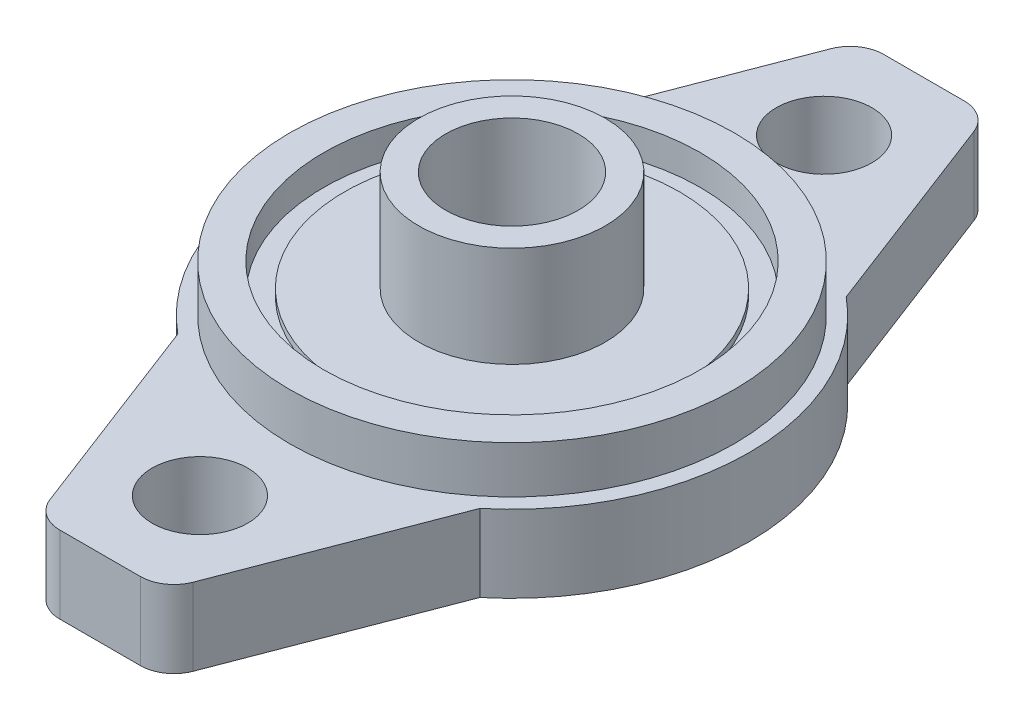
ISO-10303-21;
HEADER;
FILE_DESCRIPTION(('STEP AP214'),'2;1');
FILE_NAME('part.step','',(''),(''),'','','');
FILE_SCHEMA(('AUTOMOTIVE_DESIGN { 1 0 10303 214 1 1 1 1 }'));
ENDSEC;
DATA;
#1=APPLICATION_CONTEXT('core data for automotive mechanical design processes');
#2=APPLICATION_PROTOCOL_DEFINITION('international standard','automotive_design',2000,#1);
#3=PRODUCT_CONTEXT('',#1,'mechanical');
#4=PRODUCT('Part','Part','',(#3));
#5=PRODUCT_RELATED_PRODUCT_CATEGORY('part','',(#4));
#6=PRODUCT_DEFINITION_FORMATION('','',#4);
#7=PRODUCT_DEFINITION_CONTEXT('part definition',#1,'design');
#8=PRODUCT_DEFINITION('design','',#6,#7);
#9=PRODUCT_DEFINITION_SHAPE('','',#8);
#10=(LENGTH_UNIT() NAMED_UNIT(*) SI_UNIT(.MILLI.,.METRE.));
#11=(NAMED_UNIT(*) PLANE_ANGLE_UNIT() SI_UNIT($,.RADIAN.));
#12=(NAMED_UNIT(*) SI_UNIT($,.STERADIAN.) SOLID_ANGLE_UNIT());
#13=UNCERTAINTY_MEASURE_WITH_UNIT(LENGTH_MEASURE(1.E-05),#10,'distance_accuracy_value','');
#14=(GEOMETRIC_REPRESENTATION_CONTEXT(3) GLOBAL_UNCERTAINTY_ASSIGNED_CONTEXT((#13)) GLOBAL_UNIT_ASSIGNED_CONTEXT((#10,
#11,#12)) REPRESENTATION_CONTEXT('',''));
#15=CARTESIAN_POINT('',(0.,0.,0.));
#16=DIRECTION('',(0.,0.,1.));
#17=DIRECTION('',(1.,0.,0.));
#18=AXIS2_PLACEMENT_3D('',#15,#16,#17);
#19=CARTESIAN_POINT('',(0.,7.62,0.));
#20=DIRECTION('',(0.,-1.,0.));
#21=DIRECTION('',(0.,0.,-1.));
#22=AXIS2_PLACEMENT_3D('',#19,#20,#21);
#23=CYLINDRICAL_SURFACE('',#22,12.66825);
#24=CARTESIAN_POINT('',(0.,7.62,0.));
#25=DIRECTION('',(0.,1.,0.));
#26=DIRECTION('',(0.,0.,1.));
#27=AXIS2_PLACEMENT_3D('',#24,#25,#26);
#28=CIRCLE('',#27,12.66825);
#29=CARTESIAN_POINT('',(0.,7.62,-12.66825));
#30=VERTEX_POINT('',#29);
#31=EDGE_CURVE('E221',#30,#30,#28,.T.);
#32=CARTESIAN_POINT('',(0.,7.112,0.));
#33=DIRECTION('',(0.,-1.,0.));
#34=DIRECTION('',(0.,0.,-1.));
#35=AXIS2_PLACEMENT_3D('',#32,#33,#34);
#36=CIRCLE('',#35,12.66825);
#37=CARTESIAN_POINT('',(0.,7.112,-12.66825));
#38=VERTEX_POINT('',#37);
#39=EDGE_CURVE('E46',#38,#38,#36,.T.);
#40=CARTESIAN_POINT('',(0.,7.62,-12.66825));
#41=CARTESIAN_POINT('',(0.,7.61470833333333,-12.66825));
#42=CARTESIAN_POINT('',(0.,7.60941666666667,-12.66825));
#43=CARTESIAN_POINT('',(0.,7.59883333333333,-12.66825));
#44=CARTESIAN_POINT('',(0.,7.59354166666667,-12.66825));
#45=CARTESIAN_POINT('',(0.,7.58295833333333,-12.66825));
#46=CARTESIAN_POINT('',(0.,7.57766666666667,-12.66825));
#47=CARTESIAN_POINT('',(0.,7.56708333333333,-12.66825));
#48=CARTESIAN_POINT('',(0.,7.56179166666667,-12.66825));
#49=CARTESIAN_POINT('',(0.,7.55120833333333,-12.66825));
#50=CARTESIAN_POINT('',(0.,7.54591666666667,-12.66825));
#51=CARTESIAN_POINT('',(0.,7.53533333333333,-12.66825));
#52=CARTESIAN_POINT('',(0.,7.53004166666667,-12.66825));
#53=CARTESIAN_POINT('',(0.,7.51945833333333,-12.66825));
#54=CARTESIAN_POINT('',(0.,7.51416666666667,-12.66825));
#55=CARTESIAN_POINT('',(0.,7.50358333333333,-12.66825));
#56=CARTESIAN_POINT('',(0.,7.49829166666667,-12.66825));
#57=CARTESIAN_POINT('',(0.,7.48770833333333,-12.66825));
#58=CARTESIAN_POINT('',(0.,7.48241666666667,-12.66825));
#59=CARTESIAN_POINT('',(0.,7.47183333333333,-12.66825));
#60=CARTESIAN_POINT('',(0.,7.46654166666667,-12.66825));
#61=CARTESIAN_POINT('',(0.,7.45595833333333,-12.66825));
#62=CARTESIAN_POINT('',(0.,7.45066666666667,-12.66825));
#63=CARTESIAN_POINT('',(0.,7.44008333333333,-12.66825));
#64=CARTESIAN_POINT('',(0.,7.43479166666667,-12.66825));
#65=CARTESIAN_POINT('',(0.,7.42420833333333,-12.66825));
#66=CARTESIAN_POINT('',(0.,7.41891666666667,-12.66825));
#67=CARTESIAN_POINT('',(0.,7.40833333333333,-12.66825));
#68=CARTESIAN_POINT('',(0.,7.40304166666667,-12.66825));
#69=CARTESIAN_POINT('',(0.,7.39245833333333,-12.66825));
#70=CARTESIAN_POINT('',(0.,7.38716666666667,-12.66825));
#71=CARTESIAN_POINT('',(0.,7.37658333333333,-12.66825));
#72=CARTESIAN_POINT('',(0.,7.37129166666667,-12.66825));
#73=CARTESIAN_POINT('',(0.,7.36070833333333,-12.66825));
#74=CARTESIAN_POINT('',(0.,7.35541666666667,-12.66825));
#75=CARTESIAN_POINT('',(0.,7.34483333333333,-12.66825));
#76=CARTESIAN_POINT('',(0.,7.33954166666667,-12.66825));
#77=CARTESIAN_POINT('',(0.,7.32895833333333,-12.66825));
#78=CARTESIAN_POINT('',(0.,7.32366666666667,-12.66825));
#79=CARTESIAN_POINT('',(0.,7.31308333333333,-12.66825));
#80=CARTESIAN_POINT('',(0.,7.30779166666667,-12.66825));
#81=CARTESIAN_POINT('',(0.,7.29720833333333,-12.66825));
#82=CARTESIAN_POINT('',(0.,7.29191666666667,-12.66825));
#83=CARTESIAN_POINT('',(0.,7.28133333333333,-12.66825));
#84=CARTESIAN_POINT('',(0.,7.27604166666667,-12.66825));
#85=CARTESIAN_POINT('',(0.,7.26545833333333,-12.66825));
#86=CARTESIAN_POINT('',(0.,7.26016666666667,-12.66825));
#87=CARTESIAN_POINT('',(0.,7.24958333333333,-12.66825));
#88=CARTESIAN_POINT('',(0.,7.24429166666667,-12.66825));
#89=CARTESIAN_POINT('',(0.,7.23370833333333,-12.66825));
#90=CARTESIAN_POINT('',(0.,7.22841666666667,-12.66825));
#91=CARTESIAN_POINT('',(0.,7.21783333333333,-12.66825));
#92=CARTESIAN_POINT('',(0.,7.21254166666667,-12.66825));
#93=CARTESIAN_POINT('',(0.,7.20195833333333,-12.66825));
#94=CARTESIAN_POINT('',(0.,7.19666666666667,-12.66825));
#95=CARTESIAN_POINT('',(0.,7.18608333333333,-12.66825));
#96=CARTESIAN_POINT('',(0.,7.18079166666667,-12.66825));
#97=CARTESIAN_POINT('',(0.,7.17020833333333,-12.66825));
#98=CARTESIAN_POINT('',(0.,7.16491666666667,-12.66825));
#99=CARTESIAN_POINT('',(0.,7.15433333333333,-12.66825));
#100=CARTESIAN_POINT('',(0.,7.14904166666667,-12.66825));
#101=CARTESIAN_POINT('',(0.,7.13845833333333,-12.66825));
#102=CARTESIAN_POINT('',(0.,7.13316666666667,-12.66825));
#103=CARTESIAN_POINT('',(0.,7.12258333333333,-12.66825));
#104=CARTESIAN_POINT('',(0.,7.11729166666667,-12.66825));
#105=CARTESIAN_POINT('',(0.,7.112,-12.66825));
#106=B_SPLINE_CURVE_WITH_KNOTS('',3,(#40,#41,#42,#43,#44,#45,#46,#47,#48,#49,#50,#51,#52,#53,
#54,#55,#56,#57,#58,#59,#60,#61,#62,#63,#64,#65,#66,#67,#68,#69,#70,#71,#72,#73,#74,#75,#76,#77,
#78,#79,#80,#81,#82,#83,#84,#85,#86,#87,#88,#89,#90,#91,#92,#93,#94,#95,#96,#97,#98,#99,#100,
#101,#102,#103,#104,#105),.UNSPECIFIED.,.F.,.F.,(4,2,2,2,2,2,2,2,2,2,2,2,2,2,2,2,2,2,2,2,2,2,2,
2,2,2,2,2,2,2,2,2,4),(0.,0.0158750000000003,0.0317500000000005,0.0476249999999999,
0.0635000000000002,0.0793750000000004,0.0952499999999998,0.111125,0.127,0.142875,0.15875,
0.174624999999999,0.1905,0.206375,0.222249999999999,0.238125,0.253999999999999,
0.269874999999999,0.28575,0.301624999999999,0.317499999999999,0.333374999999999,
0.349249999999999,0.365124999999999,0.380999999999999,0.396874999999999,0.412749999999999,
0.428624999999998,0.444499999999999,0.460374999999999,0.476249999999998,0.492124999999999,
0.507999999999998),.UNSPECIFIED.);
#107=EDGE_CURVE('BSEAM37',#30,#38,#106,.T.);
#108=ORIENTED_EDGE('',*,*,#31,.F.);
#109=ORIENTED_EDGE('',*,*,#39,.F.);
#110=ORIENTED_EDGE('',*,*,#107,.T.);
#111=ORIENTED_EDGE('',*,*,#107,.F.);
#112=EDGE_LOOP('',(#108,#110,#109,#111));
#113=FACE_BOUND('',#112,.T.);
#114=ADVANCED_FACE('F37',(#113),#23,.T.);
#115=CARTESIAN_POINT('',(0.,15.24,0.));
#116=DIRECTION('',(0.,1.,0.));
#117=DIRECTION('',(0.,0.,1.));
#118=AXIS2_PLACEMENT_3D('',#115,#116,#117);
#119=PLANE('',#118);
#120=CARTESIAN_POINT('',(0.,15.24,0.));
#121=DIRECTION('',(0.,1.,0.));
#122=DIRECTION('',(0.,0.,1.));
#123=AXIS2_PLACEMENT_3D('',#120,#121,#122);
#124=CIRCLE('',#123,7.0612);
#125=CARTESIAN_POINT('',(0.,15.24,-7.0612));
#126=VERTEX_POINT('',#125);
#127=EDGE_CURVE('E228',#126,#126,#124,.T.);
#128=ORIENTED_EDGE('',*,*,#127,.T.);
#129=EDGE_LOOP('',(#128));
#130=FACE_BOUND('',#129,.T.);
#131=CARTESIAN_POINT('',(0.,15.24,0.));
#132=DIRECTION('',(0.,1.,0.));
#133=DIRECTION('',(0.,0.,1.));
#134=AXIS2_PLACEMENT_3D('',#131,#132,#133);
#135=CIRCLE('',#134,5.0165);
#136=CARTESIAN_POINT('',(0.,15.24,-5.0165));
#137=VERTEX_POINT('',#136);
#138=EDGE_CURVE('E225',#137,#137,#135,.T.);
#139=ORIENTED_EDGE('',*,*,#138,.F.);
#140=EDGE_LOOP('',(#139));
#141=FACE_BOUND('',#140,.T.);
#142=ADVANCED_FACE('F239',(#130,#141),#119,.T.);
#143=CARTESIAN_POINT('',(0.,0.,0.));
#144=DIRECTION('',(0.,1.,0.));
#145=DIRECTION('',(0.,0.,1.));
#146=AXIS2_PLACEMENT_3D('',#143,#144,#145);
#147=PLANE('',#146);
#148=CARTESIAN_POINT('',(0.,0.,-23.622));
#149=DIRECTION('',(0.,1.,0.));
#150=DIRECTION('',(0.,0.,1.));
#151=AXIS2_PLACEMENT_3D('',#148,#149,#150);
#152=CIRCLE('',#151,3.6195);
#153=CARTESIAN_POINT('',(0.,0.,-20.0025));
#154=VERTEX_POINT('',#153);
#155=EDGE_CURVE('E162',#154,#154,#152,.F.);
#156=ORIENTED_EDGE('',*,*,#155,.F.);
#157=EDGE_LOOP('',(#156));
#158=FACE_BOUND('',#157,.T.);
#159=CARTESIAN_POINT('',(0.,0.,23.622));
#160=DIRECTION('',(0.,1.,0.));
#161=DIRECTION('',(0.,0.,1.));
#162=AXIS2_PLACEMENT_3D('',#159,#160,#161);
#163=CIRCLE('',#162,3.6195);
#164=CARTESIAN_POINT('',(0.,0.,27.2415));
#165=VERTEX_POINT('',#164);
#166=EDGE_CURVE('E268',#165,#165,#163,.F.);
#167=ORIENTED_EDGE('',*,*,#166,.F.);
#168=EDGE_LOOP('',(#167));
#169=FACE_BOUND('',#168,.T.);
#170=CARTESIAN_POINT('',(0.,0.,0.));
#171=DIRECTION('',(0.,1.,0.));
#172=DIRECTION('',(0.,0.,1.));
#173=AXIS2_PLACEMENT_3D('',#170,#171,#172);
#174=CIRCLE('',#173,5.0165);
#175=CARTESIAN_POINT('',(0.,0.,-5.0165));
#176=VERTEX_POINT('',#175);
#177=EDGE_CURVE('E224',#176,#176,#174,.T.);
#178=ORIENTED_EDGE('',*,*,#177,.T.);
#179=EDGE_LOOP('',(#178));
#180=FACE_BOUND('',#179,.T.);
#181=DIRECTION('',(0.357903304948953,0.,-0.93375865420708));
#182=VECTOR('',#181,1.);
#183=CARTESIAN_POINT('',(-14.6001664439951,0.,-5.59614392816304));
#184=LINE('',#183,#182);
#185=CARTESIAN_POINT('',(-11.43,0.,-13.8670101409785));
#186=VERTEX_POINT('',#185);
#187=CARTESIAN_POINT('',(-5.41974698168598,0.,-29.5475743945703));
#188=VERTEX_POINT('',#187);
#189=EDGE_CURVE('E159',#186,#188,#184,.T.);
#190=ORIENTED_EDGE('',*,*,#189,.T.);
#191=CARTESIAN_POINT('',(-3.048,0.,-28.6385));
#192=DIRECTION('',(0.,1.,0.));
#193=DIRECTION('',(0.,0.,1.));
#194=AXIS2_PLACEMENT_3D('',#191,#192,#193);
#195=CIRCLE('',#194,2.54);
#196=CARTESIAN_POINT('',(-3.048,0.,-31.1785));
#197=VERTEX_POINT('',#196);
#198=EDGE_CURVE('E184',#188,#197,#195,.F.);
#199=ORIENTED_EDGE('',*,*,#198,.T.);
#200=DIRECTION('',(-1.,0.,0.));
#201=VECTOR('',#200,1.);
#202=CARTESIAN_POINT('',(0.,0.,-31.1785));
#203=LINE('',#202,#201);
#204=CARTESIAN_POINT('',(3.048,0.,-31.1785));
#205=VERTEX_POINT('',#204);
#206=EDGE_CURVE('E182',#205,#197,#203,.T.);
#207=ORIENTED_EDGE('',*,*,#206,.F.);
#208=CARTESIAN_POINT('',(3.048,0.,-28.6385));
#209=DIRECTION('',(0.,1.,0.));
#210=DIRECTION('',(0.,0.,1.));
#211=AXIS2_PLACEMENT_3D('',#208,#209,#210);
#212=CIRCLE('',#211,2.54);
#213=CARTESIAN_POINT('',(5.41974698168598,0.,-29.5475743945703));
#214=VERTEX_POINT('',#213);
#215=EDGE_CURVE('E148',#214,#205,#212,.T.);
#216=ORIENTED_EDGE('',*,*,#215,.F.);
#217=DIRECTION('',(-0.357903304948953,0.,-0.93375865420708));
#218=VECTOR('',#217,1.);
#219=CARTESIAN_POINT('',(14.6001664439951,0.,-5.59614392816303));
#220=LINE('',#219,#218);
#221=CARTESIAN_POINT('',(11.43,0.,-13.8670101409785));
#222=VERTEX_POINT('',#221);
#223=EDGE_CURVE('E179',#222,#214,#220,.T.);
#224=ORIENTED_EDGE('',*,*,#223,.F.);
#225=CARTESIAN_POINT('',(0.,0.,0.));
#226=DIRECTION('',(0.,1.,0.));
#227=DIRECTION('',(0.,0.,1.));
#228=AXIS2_PLACEMENT_3D('',#225,#226,#227);
#229=CIRCLE('',#228,17.9705);
#230=CARTESIAN_POINT('',(11.43,0.,13.8670101409785));
#231=VERTEX_POINT('',#230);
#232=EDGE_CURVE('E165',#231,#222,#229,.T.);
#233=ORIENTED_EDGE('',*,*,#232,.F.);
#234=DIRECTION('',(-0.357903304948953,0.,0.93375865420708));
#235=VECTOR('',#234,1.);
#236=CARTESIAN_POINT('',(14.6001664439951,0.,5.59614392816303));
#237=LINE('',#236,#235);
#238=CARTESIAN_POINT('',(5.41974698168598,0.,29.5475743945703));
#239=VERTEX_POINT('',#238);
#240=EDGE_CURVE('E176',#231,#239,#237,.T.);
#241=ORIENTED_EDGE('',*,*,#240,.T.);
#242=CARTESIAN_POINT('',(3.048,0.,28.6385));
#243=DIRECTION('',(0.,1.,0.));
#244=DIRECTION('',(0.,0.,1.));
#245=AXIS2_PLACEMENT_3D('',#242,#243,#244);
#246=CIRCLE('',#245,2.54);
#247=CARTESIAN_POINT('',(3.048,0.,31.1785));
#248=VERTEX_POINT('',#247);
#249=EDGE_CURVE('E173',#239,#248,#246,.F.);
#250=ORIENTED_EDGE('',*,*,#249,.T.);
#251=DIRECTION('',(-1.,0.,0.));
#252=VECTOR('',#251,1.);
#253=CARTESIAN_POINT('',(0.,0.,31.1785));
#254=LINE('',#253,#252);
#255=CARTESIAN_POINT('',(-3.04799999999998,0.,31.1785));
#256=VERTEX_POINT('',#255);
#257=EDGE_CURVE('E170',#248,#256,#254,.T.);
#258=ORIENTED_EDGE('',*,*,#257,.T.);
#259=CARTESIAN_POINT('',(-3.04799999999998,0.,28.6385));
#260=DIRECTION('',(0.,1.,0.));
#261=DIRECTION('',(0.,0.,1.));
#262=AXIS2_PLACEMENT_3D('',#259,#260,#261);
#263=CIRCLE('',#262,2.54);
#264=CARTESIAN_POINT('',(-5.41974698168597,0.,29.5475743945703));
#265=VERTEX_POINT('',#264);
#266=EDGE_CURVE('E167',#265,#256,#263,.T.);
#267=ORIENTED_EDGE('',*,*,#266,.F.);
#268=DIRECTION('',(0.357903304948954,0.,0.933758654207079));
#269=VECTOR('',#268,1.);
#270=CARTESIAN_POINT('',(-14.6001664439951,0.,5.59614392816305));
#271=LINE('',#270,#269);
#272=CARTESIAN_POINT('',(-11.43,0.,13.8670101409785));
#273=VERTEX_POINT('',#272);
#274=EDGE_CURVE('E164',#273,#265,#271,.T.);
#275=ORIENTED_EDGE('',*,*,#274,.F.);
#276=EDGE_CURVE('E161',#186,#273,#229,.T.);
#277=ORIENTED_EDGE('',*,*,#276,.F.);
#278=EDGE_LOOP('',(#190,#199,#207,#216,#224,#233,#241,#250,#258,#267,#275,#277));
#279=FACE_BOUND('',#278,.T.);
#280=ADVANCED_FACE('F245',(#158,#169,#180,#279),#147,.F.);
#281=CARTESIAN_POINT('',(0.,15.24,0.));
#282=DIRECTION('',(0.,-1.,0.));
#283=DIRECTION('',(0.,0.,-1.));
#284=AXIS2_PLACEMENT_3D('',#281,#282,#283);
#285=CYLINDRICAL_SURFACE('',#284,7.0612);
#286=CARTESIAN_POINT('',(0.,7.62,0.));
#287=DIRECTION('',(0.,1.,0.));
#288=DIRECTION('',(0.,0.,1.));
#289=AXIS2_PLACEMENT_3D('',#286,#287,#288);
#290=CIRCLE('',#289,7.0612);
#291=CARTESIAN_POINT('',(0.,7.62,-7.0612));
#292=VERTEX_POINT('',#291);
#293=EDGE_CURVE('E218',#292,#292,#290,.T.);
#294=CARTESIAN_POINT('',(0.,7.62,-7.0612));
#295=CARTESIAN_POINT('',(0.,7.699375,-7.0612));
#296=CARTESIAN_POINT('',(0.,7.77875,-7.0612));
#297=CARTESIAN_POINT('',(0.,7.9375,-7.0612));
#298=CARTESIAN_POINT('',(0.,8.016875,-7.0612));
#299=CARTESIAN_POINT('',(0.,8.175625,-7.0612));
#300=CARTESIAN_POINT('',(0.,8.255,-7.0612));
#301=CARTESIAN_POINT('',(0.,8.41375,-7.0612));
#302=CARTESIAN_POINT('',(0.,8.493125,-7.0612));
#303=CARTESIAN_POINT('',(0.,8.651875,-7.0612));
#304=CARTESIAN_POINT('',(0.,8.73125,-7.0612));
#305=CARTESIAN_POINT('',(0.,8.89,-7.0612));
#306=CARTESIAN_POINT('',(0.,8.969375,-7.0612));
#307=CARTESIAN_POINT('',(0.,9.128125,-7.0612));
#308=CARTESIAN_POINT('',(0.,9.2075,-7.0612));
#309=CARTESIAN_POINT('',(0.,9.36625,-7.0612));
#310=CARTESIAN_POINT('',(0.,9.445625,-7.0612));
#311=CARTESIAN_POINT('',(0.,9.604375,-7.0612));
#312=CARTESIAN_POINT('',(0.,9.68375,-7.0612));
#313=CARTESIAN_POINT('',(0.,9.8425,-7.0612));
#314=CARTESIAN_POINT('',(0.,9.921875,-7.0612));
#315=CARTESIAN_POINT('',(0.,10.080625,-7.0612));
#316=CARTESIAN_POINT('',(0.,10.16,-7.0612));
#317=CARTESIAN_POINT('',(0.,10.31875,-7.0612));
#318=CARTESIAN_POINT('',(0.,10.398125,-7.0612));
#319=CARTESIAN_POINT('',(0.,10.556875,-7.0612));
#320=CARTESIAN_POINT('',(0.,10.63625,-7.0612));
#321=CARTESIAN_POINT('',(0.,10.795,-7.0612));
#322=CARTESIAN_POINT('',(0.,10.874375,-7.0612));
#323=CARTESIAN_POINT('',(0.,11.033125,-7.0612));
#324=CARTESIAN_POINT('',(0.,11.1125,-7.0612));
#325=CARTESIAN_POINT('',(0.,11.27125,-7.0612));
#326=CARTESIAN_POINT('',(0.,11.350625,-7.0612));
#327=CARTESIAN_POINT('',(0.,11.509375,-7.0612));
#328=CARTESIAN_POINT('',(0.,11.58875,-7.0612));
#329=CARTESIAN_POINT('',(0.,11.7475,-7.0612));
#330=CARTESIAN_POINT('',(0.,11.826875,-7.0612));
#331=CARTESIAN_POINT('',(0.,11.985625,-7.0612));
#332=CARTESIAN_POINT('',(0.,12.065,-7.0612));
#333=CARTESIAN_POINT('',(0.,12.22375,-7.0612));
#334=CARTESIAN_POINT('',(0.,12.303125,-7.0612));
#335=CARTESIAN_POINT('',(0.,12.461875,-7.0612));
#336=CARTESIAN_POINT('',(0.,12.54125,-7.0612));
#337=CARTESIAN_POINT('',(0.,12.7,-7.0612));
#338=CARTESIAN_POINT('',(0.,12.779375,-7.0612));
#339=CARTESIAN_POINT('',(0.,12.938125,-7.0612));
#340=CARTESIAN_POINT('',(0.,13.0175,-7.0612));
#341=CARTESIAN_POINT('',(0.,13.17625,-7.0612));
#342=CARTESIAN_POINT('',(0.,13.255625,-7.0612));
#343=CARTESIAN_POINT('',(0.,13.414375,-7.0612));
#344=CARTESIAN_POINT('',(0.,13.49375,-7.0612));
#345=CARTESIAN_POINT('',(0.,13.6525,-7.0612));
#346=CARTESIAN_POINT('',(0.,13.731875,-7.0612));
#347=CARTESIAN_POINT('',(0.,13.890625,-7.0612));
#348=CARTESIAN_POINT('',(0.,13.97,-7.0612));
#349=CARTESIAN_POINT('',(0.,14.12875,-7.0612));
#350=CARTESIAN_POINT('',(0.,14.208125,-7.0612));
#351=CARTESIAN_POINT('',(0.,14.366875,-7.0612));
#352=CARTESIAN_POINT('',(0.,14.44625,-7.0612));
#353=CARTESIAN_POINT('',(0.,14.605,-7.0612));
#354=CARTESIAN_POINT('',(0.,14.684375,-7.0612));
#355=CARTESIAN_POINT('',(0.,14.843125,-7.0612));
#356=CARTESIAN_POINT('',(0.,14.9225,-7.0612));
#357=CARTESIAN_POINT('',(0.,15.08125,-7.0612));
#358=CARTESIAN_POINT('',(0.,15.160625,-7.0612));
#359=CARTESIAN_POINT('',(0.,15.24,-7.0612));
#360=B_SPLINE_CURVE_WITH_KNOTS('',3,(#294,#295,#296,#297,#298,#299,#300,#301,#302,#303,#304,
#305,#306,#307,#308,#309,#310,#311,#312,#313,#314,#315,#316,#317,#318,#319,#320,#321,#322,#323,
#324,#325,#326,#327,#328,#329,#330,#331,#332,#333,#334,#335,#336,#337,#338,#339,#340,#341,#342,
#343,#344,#345,#346,#347,#348,#349,#350,#351,#352,#353,#354,#355,#356,#357,#358,#359),
.UNSPECIFIED.,.F.,.F.,(4,2,2,2,2,2,2,2,2,2,2,2,2,2,2,2,2,2,2,2,2,2,2,2,2,2,2,2,2,2,2,2,4),(0.,
0.238125,0.47625,0.714374999999999,0.952500000000001,1.190625,1.42875,1.666875,1.905,2.143125,
2.38125,2.619375,2.8575,3.095625,3.33375,3.571875,3.81,4.048125,4.28625,4.524375,4.7625,
5.000625,5.23875,5.476875,5.715,5.953125,6.19125,6.429375,6.6675,6.905625,7.14375,7.381875,
7.62),.UNSPECIFIED.);
#361=EDGE_CURVE('BSEAM39',#292,#126,#360,.T.);
#362=ORIENTED_EDGE('',*,*,#293,.T.);
#363=ORIENTED_EDGE('',*,*,#127,.F.);
#364=ORIENTED_EDGE('',*,*,#361,.T.);
#365=ORIENTED_EDGE('',*,*,#361,.F.);
#366=EDGE_LOOP('',(#362,#364,#363,#365));
#367=FACE_BOUND('',#366,.T.);
#368=ADVANCED_FACE('F39',(#367),#285,.T.);
#369=CARTESIAN_POINT('',(0.,15.24,0.));
#370=DIRECTION('',(0.,-1.,0.));
#371=DIRECTION('',(0.,0.,-1.));
#372=AXIS2_PLACEMENT_3D('',#369,#370,#371);
#373=CYLINDRICAL_SURFACE('',#372,5.0165);
#374=CARTESIAN_POINT('',(0.,15.24,-5.0165));
#375=CARTESIAN_POINT('',(0.,15.08125,-5.0165));
#376=CARTESIAN_POINT('',(0.,14.9225,-5.0165));
#377=CARTESIAN_POINT('',(0.,14.605,-5.0165));
#378=CARTESIAN_POINT('',(0.,14.44625,-5.0165));
#379=CARTESIAN_POINT('',(0.,14.12875,-5.0165));
#380=CARTESIAN_POINT('',(0.,13.97,-5.0165));
#381=CARTESIAN_POINT('',(0.,13.6525,-5.0165));
#382=CARTESIAN_POINT('',(0.,13.49375,-5.0165));
#383=CARTESIAN_POINT('',(0.,13.17625,-5.0165));
#384=CARTESIAN_POINT('',(0.,13.0175,-5.0165));
#385=CARTESIAN_POINT('',(0.,12.7,-5.0165));
#386=CARTESIAN_POINT('',(0.,12.54125,-5.0165));
#387=CARTESIAN_POINT('',(0.,12.22375,-5.0165));
#388=CARTESIAN_POINT('',(0.,12.065,-5.0165));
#389=CARTESIAN_POINT('',(0.,11.7475,-5.0165));
#390=CARTESIAN_POINT('',(0.,11.58875,-5.0165));
#391=CARTESIAN_POINT('',(0.,11.27125,-5.0165));
#392=CARTESIAN_POINT('',(0.,11.1125,-5.0165));
#393=CARTESIAN_POINT('',(0.,10.795,-5.0165));
#394=CARTESIAN_POINT('',(0.,10.63625,-5.0165));
#395=CARTESIAN_POINT('',(0.,10.31875,-5.0165));
#396=CARTESIAN_POINT('',(0.,10.16,-5.0165));
#397=CARTESIAN_POINT('',(0.,9.8425,-5.0165));
#398=CARTESIAN_POINT('',(0.,9.68375,-5.0165));
#399=CARTESIAN_POINT('',(0.,9.36625,-5.0165));
#400=CARTESIAN_POINT('',(0.,9.2075,-5.0165));
#401=CARTESIAN_POINT('',(0.,8.89,-5.0165));
#402=CARTESIAN_POINT('',(0.,8.73125,-5.0165));
#403=CARTESIAN_POINT('',(0.,8.41375,-5.0165));
#404=CARTESIAN_POINT('',(0.,8.255,-5.0165));
#405=CARTESIAN_POINT('',(0.,7.9375,-5.0165));
#406=CARTESIAN_POINT('',(0.,7.77875,-5.0165));
#407=CARTESIAN_POINT('',(0.,7.46125,-5.0165));
#408=CARTESIAN_POINT('',(0.,7.3025,-5.0165));
#409=CARTESIAN_POINT('',(0.,6.985,-5.0165));
#410=CARTESIAN_POINT('',(0.,6.82625,-5.0165));
#411=CARTESIAN_POINT('',(0.,6.50875,-5.0165));
#412=CARTESIAN_POINT('',(0.,6.35,-5.0165));
#413=CARTESIAN_POINT('',(0.,6.0325,-5.0165));
#414=CARTESIAN_POINT('',(0.,5.87375,-5.0165));
#415=CARTESIAN_POINT('',(0.,5.55625,-5.0165));
#416=CARTESIAN_POINT('',(0.,5.3975,-5.0165));
#417=CARTESIAN_POINT('',(0.,5.08,-5.0165));
#418=CARTESIAN_POINT('',(0.,4.92125,-5.0165));
#419=CARTESIAN_POINT('',(0.,4.60375,-5.0165));
#420=CARTESIAN_POINT('',(0.,4.445,-5.0165));
#421=CARTESIAN_POINT('',(0.,4.1275,-5.0165));
#422=CARTESIAN_POINT('',(0.,3.96875,-5.0165));
#423=CARTESIAN_POINT('',(0.,3.65125,-5.0165));
#424=CARTESIAN_POINT('',(0.,3.4925,-5.0165));
#425=CARTESIAN_POINT('',(0.,3.175,-5.0165));
#426=CARTESIAN_POINT('',(0.,3.01625,-5.0165));
#427=CARTESIAN_POINT('',(0.,2.69875,-5.0165));
#428=CARTESIAN_POINT('',(0.,2.54,-5.0165));
#429=CARTESIAN_POINT('',(0.,2.2225,-5.0165));
#430=CARTESIAN_POINT('',(0.,2.06375,-5.0165));
#431=CARTESIAN_POINT('',(0.,1.74625,-5.0165));
#432=CARTESIAN_POINT('',(0.,1.5875,-5.0165));
#433=CARTESIAN_POINT('',(0.,1.27,-5.0165));
#434=CARTESIAN_POINT('',(0.,1.11125,-5.0165));
#435=CARTESIAN_POINT('',(0.,0.79375,-5.0165));
#436=CARTESIAN_POINT('',(0.,0.634999999999999,-5.0165));
#437=CARTESIAN_POINT('',(0.,0.3175,-5.0165));
#438=CARTESIAN_POINT('',(0.,0.15875,-5.0165));
#439=CARTESIAN_POINT('',(0.,0.,-5.0165));
#440=B_SPLINE_CURVE_WITH_KNOTS('',3,(#374,#375,#376,#377,#378,#379,#380,#381,#382,#383,#384,
#385,#386,#387,#388,#389,#390,#391,#392,#393,#394,#395,#396,#397,#398,#399,#400,#401,#402,#403,
#404,#405,#406,#407,#408,#409,#410,#411,#412,#413,#414,#415,#416,#417,#418,#419,#420,#421,#422,
#423,#424,#425,#426,#427,#428,#429,#430,#431,#432,#433,#434,#435,#436,#437,#438,#439),
.UNSPECIFIED.,.F.,.F.,(4,2,2,2,2,2,2,2,2,2,2,2,2,2,2,2,2,2,2,2,2,2,2,2,2,2,2,2,2,2,2,2,4),(0.,
0.476250000000001,0.9525,1.42875,1.905,2.38125,2.8575,3.33375,3.81,4.28625,4.7625,5.23875,5.715,
6.19125,6.6675,7.14375,7.62,8.09625,8.5725,9.04875,9.525,10.00125,10.4775,10.95375,11.43,
11.90625,12.3825,12.85875,13.335,13.81125,14.2875,14.76375,15.24),.UNSPECIFIED.);
#441=EDGE_CURVE('BSEAM253',#137,#176,#440,.T.);
#442=ORIENTED_EDGE('',*,*,#138,.T.);
#443=ORIENTED_EDGE('',*,*,#177,.F.);
#444=ORIENTED_EDGE('',*,*,#441,.T.);
#445=ORIENTED_EDGE('',*,*,#441,.F.);
#446=EDGE_LOOP('',(#442,#444,#443,#445));
#447=FACE_BOUND('',#446,.T.);
#448=ADVANCED_FACE('F253',(#447),#373,.F.);
#449=CARTESIAN_POINT('',(0.,7.62,0.));
#450=DIRECTION('',(0.,1.,0.));
#451=DIRECTION('',(0.,0.,1.));
#452=AXIS2_PLACEMENT_3D('',#449,#450,#451);
#453=PLANE('',#452);
#454=ORIENTED_EDGE('',*,*,#31,.T.);
#455=EDGE_LOOP('',(#454));
#456=FACE_BOUND('',#455,.T.);
#457=ORIENTED_EDGE('',*,*,#293,.F.);
#458=EDGE_LOOP('',(#457));
#459=FACE_BOUND('',#458,.T.);
#460=ADVANCED_FACE('F251',(#456,#459),#453,.T.);
#461=CARTESIAN_POINT('',(0.,7.112,0.));
#462=DIRECTION('',(0.,-1.,0.));
#463=DIRECTION('',(0.,0.,-1.));
#464=AXIS2_PLACEMENT_3D('',#461,#462,#463);
#465=PLANE('',#464);
#466=ORIENTED_EDGE('',*,*,#39,.T.);
#467=EDGE_LOOP('',(#466));
#468=FACE_BOUND('',#467,.T.);
#469=CARTESIAN_POINT('',(0.,7.112,0.));
#470=DIRECTION('',(0.,-1.,0.));
#471=DIRECTION('',(0.,0.,-1.));
#472=AXIS2_PLACEMENT_3D('',#469,#470,#471);
#473=CIRCLE('',#472,14.2494);
#474=CARTESIAN_POINT('',(0.,7.112,-14.2494));
#475=VERTEX_POINT('',#474);
#476=EDGE_CURVE('E215',#475,#475,#473,.T.);
#477=ORIENTED_EDGE('',*,*,#476,.F.);
#478=EDGE_LOOP('',(#477));
#479=FACE_BOUND('',#478,.T.);
#480=ADVANCED_FACE('F235',(#468,#479),#465,.F.);
#481=CARTESIAN_POINT('',(0.,9.398,0.));
#482=DIRECTION('',(0.,-1.,0.));
#483=DIRECTION('',(0.,0.,-1.));
#484=AXIS2_PLACEMENT_3D('',#481,#482,#483);
#485=CYLINDRICAL_SURFACE('',#484,14.2494);
#486=CARTESIAN_POINT('',(0.,9.398,0.));
#487=DIRECTION('',(0.,-1.,0.));
#488=DIRECTION('',(0.,0.,-1.));
#489=AXIS2_PLACEMENT_3D('',#486,#487,#488);
#490=CIRCLE('',#489,14.2494);
#491=CARTESIAN_POINT('',(0.,9.398,-14.2494));
#492=VERTEX_POINT('',#491);
#493=EDGE_CURVE('E209',#492,#492,#490,.T.);
#494=ORIENTED_EDGE('',*,*,#493,.F.);
#495=EDGE_LOOP('',(#494));
#496=FACE_BOUND('',#495,.T.);
#497=ORIENTED_EDGE('',*,*,#476,.T.);
#498=EDGE_LOOP('',(#497));
#499=FACE_BOUND('',#498,.T.);
#500=ADVANCED_FACE('F321',(#496,#499),#485,.F.);
#501=CARTESIAN_POINT('',(0.,9.398,0.));
#502=DIRECTION('',(0.,-1.,0.));
#503=DIRECTION('',(0.,0.,-1.));
#504=AXIS2_PLACEMENT_3D('',#501,#502,#503);
#505=CYLINDRICAL_SURFACE('',#504,16.8275);
#506=CARTESIAN_POINT('',(0.,5.842,0.));
#507=DIRECTION('',(0.,1.,0.));
#508=DIRECTION('',(0.,0.,1.));
#509=AXIS2_PLACEMENT_3D('',#506,#507,#508);
#510=CIRCLE('',#509,16.8275);
#511=CARTESIAN_POINT('',(0.,5.842,16.8275));
#512=VERTEX_POINT('',#511);
#513=EDGE_CURVE('E11',#512,#512,#510,.F.);
#514=ORIENTED_EDGE('',*,*,#513,.F.);
#515=EDGE_LOOP('',(#514));
#516=FACE_BOUND('',#515,.T.);
#517=CARTESIAN_POINT('',(0.,9.398,0.));
#518=DIRECTION('',(0.,-1.,0.));
#519=DIRECTION('',(0.,0.,-1.));
#520=AXIS2_PLACEMENT_3D('',#517,#518,#519);
#521=CIRCLE('',#520,16.8275);
#522=CARTESIAN_POINT('',(0.,9.398,-16.8275));
#523=VERTEX_POINT('',#522);
#524=EDGE_CURVE('E212',#523,#523,#521,.T.);
#525=ORIENTED_EDGE('',*,*,#524,.T.);
#526=EDGE_LOOP('',(#525));
#527=FACE_BOUND('',#526,.T.);
#528=ADVANCED_FACE('F324',(#516,#527),#505,.T.);
#529=CARTESIAN_POINT('',(0.,9.398,0.));
#530=DIRECTION('',(0.,-1.,0.));
#531=DIRECTION('',(0.,0.,-1.));
#532=AXIS2_PLACEMENT_3D('',#529,#530,#531);
#533=PLANE('',#532);
#534=ORIENTED_EDGE('',*,*,#493,.T.);
#535=EDGE_LOOP('',(#534));
#536=FACE_BOUND('',#535,.T.);
#537=ORIENTED_EDGE('',*,*,#524,.F.);
#538=EDGE_LOOP('',(#537));
#539=FACE_BOUND('',#538,.T.);
#540=ADVANCED_FACE('F320',(#536,#539),#533,.F.);
#541=CARTESIAN_POINT('',(-14.6001664439951,5.842,-5.59614392816304));
#542=DIRECTION('',(-0.93375865420708,0.,-0.357903304948953));
#543=DIRECTION('',(-0.357903304948953,0.,0.93375865420708));
#544=AXIS2_PLACEMENT_3D('',#541,#542,#543);
#545=PLANE('',#544);
#546=ORIENTED_EDGE('',*,*,#189,.F.);
#547=DIRECTION('',(0.,-1.,0.));
#548=VECTOR('',#547,1.);
#549=CARTESIAN_POINT('',(-11.43,5.842,-13.8670101409785));
#550=LINE('',#549,#548);
#551=CARTESIAN_POINT('',(-11.43,5.842,-13.8670101409785));
#552=VERTEX_POINT('',#551);
#553=EDGE_CURVE('E102',#552,#186,#550,.T.);
#554=ORIENTED_EDGE('',*,*,#553,.F.);
#555=DIRECTION('',(0.357903304948953,0.,-0.93375865420708));
#556=VECTOR('',#555,1.);
#557=CARTESIAN_POINT('',(-14.6001664439951,5.842,-5.59614392816304));
#558=LINE('',#557,#556);
#559=CARTESIAN_POINT('',(-5.41974698168598,5.842,-29.5475743945703));
#560=VERTEX_POINT('',#559);
#561=EDGE_CURVE('E187',#552,#560,#558,.T.);
#562=ORIENTED_EDGE('',*,*,#561,.T.);
#563=DIRECTION('',(0.,-1.,0.));
#564=VECTOR('',#563,1.);
#565=CARTESIAN_POINT('',(-5.41974698168598,5.842,-29.5475743945703));
#566=LINE('',#565,#564);
#567=EDGE_CURVE('E54',#560,#188,#566,.T.);
#568=ORIENTED_EDGE('',*,*,#567,.T.);
#569=EDGE_LOOP('',(#546,#554,#562,#568));
#570=FACE_BOUND('',#569,.T.);
#571=ADVANCED_FACE('F317',(#570),#545,.T.);
#572=CARTESIAN_POINT('',(0.,5.842,0.));
#573=DIRECTION('',(0.,-1.,0.));
#574=DIRECTION('',(0.,0.,-1.));
#575=AXIS2_PLACEMENT_3D('',#572,#573,#574);
#576=CYLINDRICAL_SURFACE('',#575,17.9705);
#577=ORIENTED_EDGE('',*,*,#276,.T.);
#578=DIRECTION('',(0.,-1.,0.));
#579=VECTOR('',#578,1.);
#580=CARTESIAN_POINT('',(-11.43,5.842,13.8670101409785));
#581=LINE('',#580,#579);
#582=CARTESIAN_POINT('',(-11.43,5.842,13.8670101409785));
#583=VERTEX_POINT('',#582);
#584=EDGE_CURVE('E205',#583,#273,#581,.T.);
#585=ORIENTED_EDGE('',*,*,#584,.F.);
#586=CARTESIAN_POINT('',(0.,5.842,0.));
#587=DIRECTION('',(0.,1.,0.));
#588=DIRECTION('',(0.,0.,1.));
#589=AXIS2_PLACEMENT_3D('',#586,#587,#588);
#590=CIRCLE('',#589,17.9705);
#591=EDGE_CURVE('E508',#552,#583,#590,.T.);
#592=ORIENTED_EDGE('',*,*,#591,.F.);
#593=ORIENTED_EDGE('',*,*,#553,.T.);
#594=EDGE_LOOP('',(#577,#585,#592,#593));
#595=FACE_BOUND('',#594,.T.);
#596=ADVANCED_FACE('F297',(#595),#576,.T.);
#597=CARTESIAN_POINT('',(-14.6001664439951,5.842,5.59614392816305));
#598=DIRECTION('',(0.933758654207079,0.,-0.357903304948954));
#599=DIRECTION('',(-0.357903304948954,0.,-0.933758654207079));
#600=AXIS2_PLACEMENT_3D('',#597,#598,#599);
#601=PLANE('',#600);
#602=ORIENTED_EDGE('',*,*,#274,.T.);
#603=DIRECTION('',(0.,-1.,0.));
#604=VECTOR('',#603,1.);
#605=CARTESIAN_POINT('',(-5.41974698168597,5.842,29.5475743945703));
#606=LINE('',#605,#604);
#607=CARTESIAN_POINT('',(-5.41974698168597,5.842,29.5475743945703));
#608=VERTEX_POINT('',#607);
#609=EDGE_CURVE('E202',#608,#265,#606,.T.);
#610=ORIENTED_EDGE('',*,*,#609,.F.);
#611=DIRECTION('',(0.357903304948954,0.,0.933758654207079));
#612=VECTOR('',#611,1.);
#613=CARTESIAN_POINT('',(-14.6001664439951,5.842,5.59614392816305));
#614=LINE('',#613,#612);
#615=EDGE_CURVE('E510',#583,#608,#614,.T.);
#616=ORIENTED_EDGE('',*,*,#615,.F.);
#617=ORIENTED_EDGE('',*,*,#584,.T.);
#618=EDGE_LOOP('',(#602,#610,#616,#617));
#619=FACE_BOUND('',#618,.T.);
#620=ADVANCED_FACE('F312',(#619),#601,.F.);
#621=CARTESIAN_POINT('',(-3.04799999999998,5.842,28.6385));
#622=DIRECTION('',(0.,-1.,0.));
#623=DIRECTION('',(0.,0.,-1.));
#624=AXIS2_PLACEMENT_3D('',#621,#622,#623);
#625=CYLINDRICAL_SURFACE('',#624,2.54);
#626=ORIENTED_EDGE('',*,*,#266,.T.);
#627=DIRECTION('',(0.,-1.,0.));
#628=VECTOR('',#627,1.);
#629=CARTESIAN_POINT('',(-3.04799999999998,5.842,31.1785));
#630=LINE('',#629,#628);
#631=CARTESIAN_POINT('',(-3.04799999999998,5.842,31.1785));
#632=VERTEX_POINT('',#631);
#633=EDGE_CURVE('E200',#632,#256,#630,.T.);
#634=ORIENTED_EDGE('',*,*,#633,.F.);
#635=CARTESIAN_POINT('',(-3.04799999999998,5.842,28.6385));
#636=DIRECTION('',(0.,1.,0.));
#637=DIRECTION('',(0.,0.,1.));
#638=AXIS2_PLACEMENT_3D('',#635,#636,#637);
#639=CIRCLE('',#638,2.54);
#640=EDGE_CURVE('E513',#608,#632,#639,.T.);
#641=ORIENTED_EDGE('',*,*,#640,.F.);
#642=ORIENTED_EDGE('',*,*,#609,.T.);
#643=EDGE_LOOP('',(#626,#634,#641,#642));
#644=FACE_BOUND('',#643,.T.);
#645=ADVANCED_FACE('F308',(#644),#625,.T.);
#646=CARTESIAN_POINT('',(0.,5.842,31.1785));
#647=DIRECTION('',(0.,0.,1.));
#648=DIRECTION('',(1.,0.,0.));
#649=AXIS2_PLACEMENT_3D('',#646,#647,#648);
#650=PLANE('',#649);
#651=ORIENTED_EDGE('',*,*,#257,.F.);
#652=DIRECTION('',(0.,-1.,0.));
#653=VECTOR('',#652,1.);
#654=CARTESIAN_POINT('',(3.048,5.842,31.1785));
#655=LINE('',#654,#653);
#656=CARTESIAN_POINT('',(3.048,5.842,31.1785));
#657=VERTEX_POINT('',#656);
#658=EDGE_CURVE('E198',#657,#248,#655,.T.);
#659=ORIENTED_EDGE('',*,*,#658,.F.);
#660=DIRECTION('',(-1.,0.,0.));
#661=VECTOR('',#660,1.);
#662=CARTESIAN_POINT('',(0.,5.842,31.1785));
#663=LINE('',#662,#661);
#664=EDGE_CURVE('E515',#657,#632,#663,.T.);
#665=ORIENTED_EDGE('',*,*,#664,.T.);
#666=ORIENTED_EDGE('',*,*,#633,.T.);
#667=EDGE_LOOP('',(#651,#659,#665,#666));
#668=FACE_BOUND('',#667,.T.);
#669=ADVANCED_FACE('F304',(#668),#650,.T.);
#670=CARTESIAN_POINT('',(3.048,5.842,28.6385));
#671=DIRECTION('',(0.,-1.,0.));
#672=DIRECTION('',(0.,0.,-1.));
#673=AXIS2_PLACEMENT_3D('',#670,#671,#672);
#674=CYLINDRICAL_SURFACE('',#673,2.54);
#675=ORIENTED_EDGE('',*,*,#249,.F.);
#676=DIRECTION('',(0.,-1.,0.));
#677=VECTOR('',#676,1.);
#678=CARTESIAN_POINT('',(5.41974698168598,5.842,29.5475743945703));
#679=LINE('',#678,#677);
#680=CARTESIAN_POINT('',(5.41974698168598,5.842,29.5475743945703));
#681=VERTEX_POINT('',#680);
#682=EDGE_CURVE('E196',#681,#239,#679,.T.);
#683=ORIENTED_EDGE('',*,*,#682,.F.);
#684=CARTESIAN_POINT('',(3.048,5.842,28.6385));
#685=DIRECTION('',(0.,1.,0.));
#686=DIRECTION('',(0.,0.,1.));
#687=AXIS2_PLACEMENT_3D('',#684,#685,#686);
#688=CIRCLE('',#687,2.54);
#689=EDGE_CURVE('E518',#681,#657,#688,.F.);
#690=ORIENTED_EDGE('',*,*,#689,.T.);
#691=ORIENTED_EDGE('',*,*,#658,.T.);
#692=EDGE_LOOP('',(#675,#683,#690,#691));
#693=FACE_BOUND('',#692,.T.);
#694=ADVANCED_FACE('F300',(#693),#674,.T.);
#695=CARTESIAN_POINT('',(14.6001664439951,5.842,5.59614392816303));
#696=DIRECTION('',(0.93375865420708,0.,0.357903304948953));
#697=DIRECTION('',(0.357903304948953,0.,-0.93375865420708));
#698=AXIS2_PLACEMENT_3D('',#695,#696,#697);
#699=PLANE('',#698);
#700=ORIENTED_EDGE('',*,*,#240,.F.);
#701=DIRECTION('',(0.,-1.,0.));
#702=VECTOR('',#701,1.);
#703=CARTESIAN_POINT('',(11.43,5.842,13.8670101409785));
#704=LINE('',#703,#702);
#705=CARTESIAN_POINT('',(11.43,5.842,13.8670101409785));
#706=VERTEX_POINT('',#705);
#707=EDGE_CURVE('E194',#706,#231,#704,.T.);
#708=ORIENTED_EDGE('',*,*,#707,.F.);
#709=DIRECTION('',(-0.357903304948953,0.,0.93375865420708));
#710=VECTOR('',#709,1.);
#711=CARTESIAN_POINT('',(14.6001664439951,5.842,5.59614392816303));
#712=LINE('',#711,#710);
#713=EDGE_CURVE('E521',#706,#681,#712,.T.);
#714=ORIENTED_EDGE('',*,*,#713,.T.);
#715=ORIENTED_EDGE('',*,*,#682,.T.);
#716=EDGE_LOOP('',(#700,#708,#714,#715));
#717=FACE_BOUND('',#716,.T.);
#718=ADVANCED_FACE('F295',(#717),#699,.T.);
#719=ORIENTED_EDGE('',*,*,#232,.T.);
#720=DIRECTION('',(0.,-1.,0.));
#721=VECTOR('',#720,1.);
#722=CARTESIAN_POINT('',(11.43,5.842,-13.8670101409785));
#723=LINE('',#722,#721);
#724=CARTESIAN_POINT('',(11.43,5.842,-13.8670101409785));
#725=VERTEX_POINT('',#724);
#726=EDGE_CURVE('E191',#725,#222,#723,.T.);
#727=ORIENTED_EDGE('',*,*,#726,.F.);
#728=EDGE_CURVE('E511',#706,#725,#590,.T.);
#729=ORIENTED_EDGE('',*,*,#728,.F.);
#730=ORIENTED_EDGE('',*,*,#707,.T.);
#731=EDGE_LOOP('',(#719,#727,#729,#730));
#732=FACE_BOUND('',#731,.T.);
#733=ADVANCED_FACE('F291',(#732),#576,.T.);
#734=CARTESIAN_POINT('',(14.6001664439951,5.842,-5.59614392816303));
#735=DIRECTION('',(-0.93375865420708,0.,0.357903304948953));
#736=DIRECTION('',(0.357903304948953,0.,0.93375865420708));
#737=AXIS2_PLACEMENT_3D('',#734,#735,#736);
#738=PLANE('',#737);
#739=ORIENTED_EDGE('',*,*,#223,.T.);
#740=DIRECTION('',(0.,-1.,0.));
#741=VECTOR('',#740,1.);
#742=CARTESIAN_POINT('',(5.41974698168598,5.842,-29.5475743945703));
#743=LINE('',#742,#741);
#744=CARTESIAN_POINT('',(5.41974698168598,5.842,-29.5475743945703));
#745=VERTEX_POINT('',#744);
#746=EDGE_CURVE('E151',#745,#214,#743,.T.);
#747=ORIENTED_EDGE('',*,*,#746,.F.);
#748=DIRECTION('',(-0.357903304948953,0.,-0.93375865420708));
#749=VECTOR('',#748,1.);
#750=CARTESIAN_POINT('',(14.6001664439951,5.842,-5.59614392816303));
#751=LINE('',#750,#749);
#752=EDGE_CURVE('E139',#725,#745,#751,.T.);
#753=ORIENTED_EDGE('',*,*,#752,.F.);
#754=ORIENTED_EDGE('',*,*,#726,.T.);
#755=EDGE_LOOP('',(#739,#747,#753,#754));
#756=FACE_BOUND('',#755,.T.);
#757=ADVANCED_FACE('F288',(#756),#738,.F.);
#758=CARTESIAN_POINT('',(3.048,5.842,-28.6385));
#759=DIRECTION('',(0.,-1.,0.));
#760=DIRECTION('',(0.,0.,-1.));
#761=AXIS2_PLACEMENT_3D('',#758,#759,#760);
#762=CYLINDRICAL_SURFACE('',#761,2.54);
#763=ORIENTED_EDGE('',*,*,#215,.T.);
#764=DIRECTION('',(0.,-1.,0.));
#765=VECTOR('',#764,1.);
#766=CARTESIAN_POINT('',(3.048,5.842,-31.1785));
#767=LINE('',#766,#765);
#768=CARTESIAN_POINT('',(3.048,5.842,-31.1785));
#769=VERTEX_POINT('',#768);
#770=EDGE_CURVE('E145',#769,#205,#767,.T.);
#771=ORIENTED_EDGE('',*,*,#770,.F.);
#772=CARTESIAN_POINT('',(3.048,5.842,-28.6385));
#773=DIRECTION('',(0.,1.,0.));
#774=DIRECTION('',(0.,0.,1.));
#775=AXIS2_PLACEMENT_3D('',#772,#773,#774);
#776=CIRCLE('',#775,2.54);
#777=EDGE_CURVE('E130',#745,#769,#776,.T.);
#778=ORIENTED_EDGE('',*,*,#777,.F.);
#779=ORIENTED_EDGE('',*,*,#746,.T.);
#780=EDGE_LOOP('',(#763,#771,#778,#779));
#781=FACE_BOUND('',#780,.T.);
#782=ADVANCED_FACE('F146',(#781),#762,.T.);
#783=CARTESIAN_POINT('',(0.,5.842,-31.1785));
#784=DIRECTION('',(0.,0.,1.));
#785=DIRECTION('',(1.,0.,0.));
#786=AXIS2_PLACEMENT_3D('',#783,#784,#785);
#787=PLANE('',#786);
#788=ORIENTED_EDGE('',*,*,#206,.T.);
#789=DIRECTION('',(0.,-1.,0.));
#790=VECTOR('',#789,1.);
#791=CARTESIAN_POINT('',(-3.048,5.842,-31.1785));
#792=LINE('',#791,#790);
#793=CARTESIAN_POINT('',(-3.048,5.842,-31.1785));
#794=VERTEX_POINT('',#793);
#795=EDGE_CURVE('E93',#794,#197,#792,.T.);
#796=ORIENTED_EDGE('',*,*,#795,.F.);
#797=DIRECTION('',(-1.,0.,0.));
#798=VECTOR('',#797,1.);
#799=CARTESIAN_POINT('',(0.,5.842,-31.1785));
#800=LINE('',#799,#798);
#801=EDGE_CURVE('E137',#769,#794,#800,.T.);
#802=ORIENTED_EDGE('',*,*,#801,.F.);
#803=ORIENTED_EDGE('',*,*,#770,.T.);
#804=EDGE_LOOP('',(#788,#796,#802,#803));
#805=FACE_BOUND('',#804,.T.);
#806=ADVANCED_FACE('F153',(#805),#787,.F.);
#807=CARTESIAN_POINT('',(-3.048,5.842,-28.6385));
#808=DIRECTION('',(0.,-1.,0.));
#809=DIRECTION('',(0.,0.,-1.));
#810=AXIS2_PLACEMENT_3D('',#807,#808,#809);
#811=CYLINDRICAL_SURFACE('',#810,2.54);
#812=ORIENTED_EDGE('',*,*,#198,.F.);
#813=ORIENTED_EDGE('',*,*,#567,.F.);
#814=CARTESIAN_POINT('',(-3.048,5.842,-28.6385));
#815=DIRECTION('',(0.,1.,0.));
#816=DIRECTION('',(0.,0.,1.));
#817=AXIS2_PLACEMENT_3D('',#814,#815,#816);
#818=CIRCLE('',#817,2.54);
#819=EDGE_CURVE('E154',#560,#794,#818,.F.);
#820=ORIENTED_EDGE('',*,*,#819,.T.);
#821=ORIENTED_EDGE('',*,*,#795,.T.);
#822=EDGE_LOOP('',(#812,#813,#820,#821));
#823=FACE_BOUND('',#822,.T.);
#824=ADVANCED_FACE('F273',(#823),#811,.T.);
#825=CARTESIAN_POINT('',(0.,5.842,0.));
#826=DIRECTION('',(0.,1.,0.));
#827=DIRECTION('',(0.,0.,1.));
#828=AXIS2_PLACEMENT_3D('',#825,#826,#827);
#829=PLANE('',#828);
#830=CARTESIAN_POINT('',(0.,5.842,-23.622));
#831=DIRECTION('',(0.,1.,0.));
#832=DIRECTION('',(0.,0.,1.));
#833=AXIS2_PLACEMENT_3D('',#830,#831,#832);
#834=CIRCLE('',#833,3.6195);
#835=CARTESIAN_POINT('',(0.,5.842,-20.0025));
#836=VERTEX_POINT('',#835);
#837=EDGE_CURVE('E499',#836,#836,#834,.T.);
#838=ORIENTED_EDGE('',*,*,#837,.F.);
#839=EDGE_LOOP('',(#838));
#840=FACE_BOUND('',#839,.T.);
#841=CARTESIAN_POINT('',(0.,5.842,23.622));
#842=DIRECTION('',(0.,1.,0.));
#843=DIRECTION('',(0.,0.,-1.));
#844=AXIS2_PLACEMENT_3D('',#841,#842,#843);
#845=CIRCLE('',#844,3.6195);
#846=CARTESIAN_POINT('',(0.,5.842,20.0025));
#847=VERTEX_POINT('',#846);
#848=EDGE_CURVE('E503',#847,#847,#845,.T.);
#849=ORIENTED_EDGE('',*,*,#848,.F.);
#850=EDGE_LOOP('',(#849));
#851=FACE_BOUND('',#850,.T.);
#852=ORIENTED_EDGE('',*,*,#561,.F.);
#853=ORIENTED_EDGE('',*,*,#591,.T.);
#854=ORIENTED_EDGE('',*,*,#615,.T.);
#855=ORIENTED_EDGE('',*,*,#640,.T.);
#856=ORIENTED_EDGE('',*,*,#664,.F.);
#857=ORIENTED_EDGE('',*,*,#689,.F.);
#858=ORIENTED_EDGE('',*,*,#713,.F.);
#859=ORIENTED_EDGE('',*,*,#728,.T.);
#860=ORIENTED_EDGE('',*,*,#752,.T.);
#861=ORIENTED_EDGE('',*,*,#777,.T.);
#862=ORIENTED_EDGE('',*,*,#801,.T.);
#863=ORIENTED_EDGE('',*,*,#819,.F.);
#864=EDGE_LOOP('',(#852,#853,#854,#855,#856,#857,#858,#859,#860,#861,#862,#863));
#865=FACE_BOUND('',#864,.T.);
#866=ORIENTED_EDGE('',*,*,#513,.T.);
#867=EDGE_LOOP('',(#866));
#868=FACE_BOUND('',#867,.T.);
#869=ADVANCED_FACE('F133',(#840,#851,#865,#868),#829,.T.);
#870=CARTESIAN_POINT('',(0.,-0.00100000000000013,23.622));
#871=DIRECTION('',(0.,1.,0.));
#872=DIRECTION('',(0.,0.,1.));
#873=AXIS2_PLACEMENT_3D('',#870,#871,#872);
#874=CYLINDRICAL_SURFACE('',#873,3.6195);
#875=ORIENTED_EDGE('',*,*,#848,.T.);
#876=EDGE_LOOP('',(#875));
#877=FACE_BOUND('',#876,.T.);
#878=ORIENTED_EDGE('',*,*,#166,.T.);
#879=EDGE_LOOP('',(#878));
#880=FACE_BOUND('',#879,.T.);
#881=ADVANCED_FACE('F280',(#877,#880),#874,.F.);
#882=CARTESIAN_POINT('',(0.,-0.00100000000000013,-23.622));
#883=DIRECTION('',(0.,1.,0.));
#884=DIRECTION('',(0.,0.,1.));
#885=AXIS2_PLACEMENT_3D('',#882,#883,#884);
#886=CYLINDRICAL_SURFACE('',#885,3.6195);
#887=ORIENTED_EDGE('',*,*,#837,.T.);
#888=EDGE_LOOP('',(#887));
#889=FACE_BOUND('',#888,.T.);
#890=ORIENTED_EDGE('',*,*,#155,.T.);
#891=EDGE_LOOP('',(#890));
#892=FACE_BOUND('',#891,.T.);
#893=ADVANCED_FACE('F483',(#889,#892),#886,.F.);
#894=CLOSED_SHELL('',(#114,#142,#280,#368,#448,#460,#480,#500,#528,#540,#571,#596,#620,#645,
#669,#694,#718,#733,#757,#782,#806,#824,#869,#881,#893));
#895=MANIFOLD_SOLID_BREP('B2',#894);
#896=ADVANCED_BREP_SHAPE_REPRESENTATION('',(#18,#895),#14);
#897=SHAPE_DEFINITION_REPRESENTATION(#9,#896);
ENDSEC;
END-ISO-10303-21;
